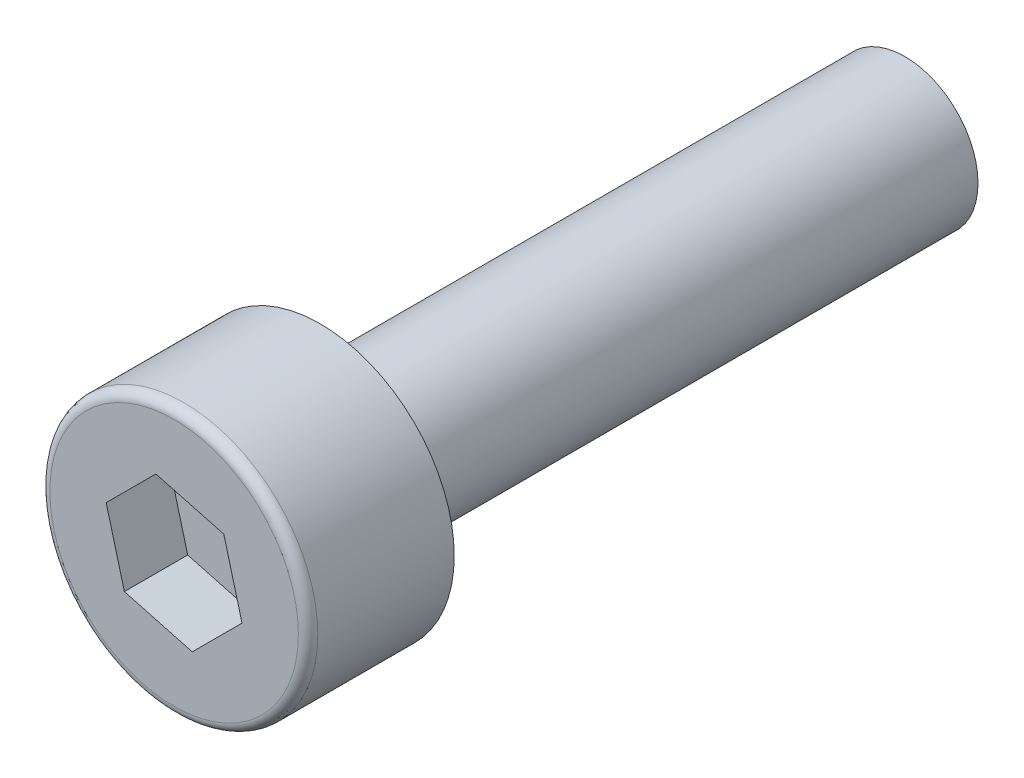
ISO-10303-21;
HEADER;
FILE_DESCRIPTION(('STEP AP214'),'2;1');
FILE_NAME('part.step','',(''),(''),'','','');
FILE_SCHEMA(('AUTOMOTIVE_DESIGN { 1 0 10303 214 1 1 1 1 }'));
ENDSEC;
DATA;
#1=APPLICATION_CONTEXT('core data for automotive mechanical design processes');
#2=APPLICATION_PROTOCOL_DEFINITION('international standard','automotive_design',2000,#1);
#3=PRODUCT_CONTEXT('',#1,'mechanical');
#4=PRODUCT('Part','Part','',(#3));
#5=PRODUCT_RELATED_PRODUCT_CATEGORY('part','',(#4));
#6=PRODUCT_DEFINITION_FORMATION('','',#4);
#7=PRODUCT_DEFINITION_CONTEXT('part definition',#1,'design');
#8=PRODUCT_DEFINITION('design','',#6,#7);
#9=PRODUCT_DEFINITION_SHAPE('','',#8);
#10=(LENGTH_UNIT() NAMED_UNIT(*) SI_UNIT(.MILLI.,.METRE.));
#11=(NAMED_UNIT(*) PLANE_ANGLE_UNIT() SI_UNIT($,.RADIAN.));
#12=(NAMED_UNIT(*) SI_UNIT($,.STERADIAN.) SOLID_ANGLE_UNIT());
#13=UNCERTAINTY_MEASURE_WITH_UNIT(LENGTH_MEASURE(1.E-05),#10,'distance_accuracy_value','');
#14=(GEOMETRIC_REPRESENTATION_CONTEXT(3) GLOBAL_UNCERTAINTY_ASSIGNED_CONTEXT((#13)) GLOBAL_UNIT_ASSIGNED_CONTEXT((#10,
#11,#12)) REPRESENTATION_CONTEXT('',''));
#15=CARTESIAN_POINT('',(0.,0.,0.));
#16=DIRECTION('',(0.,0.,1.));
#17=DIRECTION('',(1.,0.,0.));
#18=AXIS2_PLACEMENT_3D('',#15,#16,#17);
#19=CARTESIAN_POINT('',(0.,0.,0.));
#20=DIRECTION('',(0.,0.,1.));
#21=DIRECTION('',(1.,0.,0.));
#22=AXIS2_PLACEMENT_3D('',#19,#20,#21);
#23=PLANE('',#22);
#24=CARTESIAN_POINT('',(0.,0.,0.));
#25=DIRECTION('',(0.,0.,1.));
#26=DIRECTION('',(1.,0.,0.));
#27=AXIS2_PLACEMENT_3D('',#24,#25,#26);
#28=CIRCLE('',#27,2.75);
#29=CARTESIAN_POINT('',(2.75,0.,0.));
#30=VERTEX_POINT('',#29);
#31=EDGE_CURVE('E137',#30,#30,#28,.T.);
#32=ORIENTED_EDGE('',*,*,#31,.F.);
#33=EDGE_LOOP('',(#32));
#34=FACE_BOUND('',#33,.T.);
#35=CARTESIAN_POINT('',(0.,0.,0.));
#36=DIRECTION('',(0.,0.,1.));
#37=DIRECTION('',(1.,0.,0.));
#38=AXIS2_PLACEMENT_3D('',#35,#36,#37);
#39=CIRCLE('',#38,1.5);
#40=CARTESIAN_POINT('',(1.5,0.,0.));
#41=VERTEX_POINT('',#40);
#42=EDGE_CURVE('E145',#41,#41,#39,.F.);
#43=ORIENTED_EDGE('',*,*,#42,.F.);
#44=EDGE_LOOP('',(#43));
#45=FACE_BOUND('',#44,.T.);
#46=ADVANCED_FACE('F34',(#34,#45),#23,.F.);
#47=CARTESIAN_POINT('',(0.,0.,3.));
#48=DIRECTION('',(0.,0.,-1.));
#49=DIRECTION('',(-1.,0.,0.));
#50=AXIS2_PLACEMENT_3D('',#47,#48,#49);
#51=CYLINDRICAL_SURFACE('',#50,2.75);
#52=CARTESIAN_POINT('',(0.,0.,2.8));
#53=DIRECTION('',(0.,0.,1.));
#54=DIRECTION('',(1.,0.,0.));
#55=AXIS2_PLACEMENT_3D('',#52,#53,#54);
#56=CIRCLE('',#55,2.75);
#57=CARTESIAN_POINT('',(2.75,0.,2.8));
#58=VERTEX_POINT('',#57);
#59=EDGE_CURVE('E11',#58,#58,#56,.F.);
#60=ORIENTED_EDGE('',*,*,#59,.T.);
#61=EDGE_LOOP('',(#60));
#62=FACE_BOUND('',#61,.T.);
#63=ORIENTED_EDGE('',*,*,#31,.T.);
#64=EDGE_LOOP('',(#63));
#65=FACE_BOUND('',#64,.T.);
#66=ADVANCED_FACE('F164',(#62,#65),#51,.T.);
#67=CARTESIAN_POINT('',(0.,0.,3.));
#68=DIRECTION('',(0.,0.,1.));
#69=DIRECTION('',(1.,0.,0.));
#70=AXIS2_PLACEMENT_3D('',#67,#68,#69);
#71=PLANE('',#70);
#72=CARTESIAN_POINT('',(0.,0.,3.));
#73=DIRECTION('',(0.,0.,1.));
#74=DIRECTION('',(1.,0.,0.));
#75=AXIS2_PLACEMENT_3D('',#72,#73,#74);
#76=CIRCLE('',#75,2.55);
#77=CARTESIAN_POINT('',(2.55,0.,3.));
#78=VERTEX_POINT('',#77);
#79=EDGE_CURVE('E42',#78,#78,#76,.T.);
#80=ORIENTED_EDGE('',*,*,#79,.T.);
#81=EDGE_LOOP('',(#80));
#82=FACE_BOUND('',#81,.T.);
#83=DIRECTION('',(0.258819045102521,-0.965925826289068,0.));
#84=VECTOR('',#83,1.);
#85=CARTESIAN_POINT('',(-1.39419383956301,0.373573113403356,3.));
#86=LINE('',#85,#84);
#87=CARTESIAN_POINT('',(-1.39419383956301,0.373573113403356,3.));
#88=VERTEX_POINT('',#87);
#89=CARTESIAN_POINT('',(-1.02062072615966,-1.02062072615966,3.));
#90=VERTEX_POINT('',#89);
#91=EDGE_CURVE('E49',#88,#90,#86,.T.);
#92=ORIENTED_EDGE('',*,*,#91,.F.);
#93=DIRECTION('',(-0.707106781186548,-0.707106781186548,0.));
#94=VECTOR('',#93,1.);
#95=CARTESIAN_POINT('',(-0.373573113403355,1.39419383956301,3.));
#96=LINE('',#95,#94);
#97=CARTESIAN_POINT('',(-0.373573113403355,1.39419383956301,3.));
#98=VERTEX_POINT('',#97);
#99=EDGE_CURVE('E133',#98,#88,#96,.T.);
#100=ORIENTED_EDGE('',*,*,#99,.F.);
#101=DIRECTION('',(-0.965925826289068,0.258819045102521,0.));
#102=VECTOR('',#101,1.);
#103=CARTESIAN_POINT('',(1.02062072615966,1.02062072615966,3.));
#104=LINE('',#103,#102);
#105=CARTESIAN_POINT('',(1.02062072615966,1.02062072615966,3.));
#106=VERTEX_POINT('',#105);
#107=EDGE_CURVE('E131',#106,#98,#104,.T.);
#108=ORIENTED_EDGE('',*,*,#107,.F.);
#109=DIRECTION('',(-0.258819045102521,0.965925826289068,0.));
#110=VECTOR('',#109,1.);
#111=CARTESIAN_POINT('',(1.39419383956301,-0.373573113403355,3.));
#112=LINE('',#111,#110);
#113=CARTESIAN_POINT('',(1.39419383956301,-0.373573113403355,3.));
#114=VERTEX_POINT('',#113);
#115=EDGE_CURVE('E97',#114,#106,#112,.T.);
#116=ORIENTED_EDGE('',*,*,#115,.F.);
#117=DIRECTION('',(0.707106781186548,0.707106781186548,0.));
#118=VECTOR('',#117,1.);
#119=CARTESIAN_POINT('',(0.373573113403355,-1.39419383956301,3.));
#120=LINE('',#119,#118);
#121=CARTESIAN_POINT('',(0.373573113403355,-1.39419383956301,3.));
#122=VERTEX_POINT('',#121);
#123=EDGE_CURVE('E127',#122,#114,#120,.T.);
#124=ORIENTED_EDGE('',*,*,#123,.F.);
#125=DIRECTION('',(0.965925826289068,-0.258819045102521,0.));
#126=VECTOR('',#125,1.);
#127=CARTESIAN_POINT('',(-1.02062072615966,-1.02062072615966,3.));
#128=LINE('',#127,#126);
#129=EDGE_CURVE('E123',#90,#122,#128,.T.);
#130=ORIENTED_EDGE('',*,*,#129,.F.);
#131=EDGE_LOOP('',(#92,#100,#108,#116,#124,#130));
#132=FACE_BOUND('',#131,.T.);
#133=ADVANCED_FACE('F150',(#82,#132),#71,.T.);
#134=CARTESIAN_POINT('',(-1.39419383956301,0.373573113403356,1.7));
#135=DIRECTION('',(-0.965925826289068,-0.258819045102521,0.));
#136=DIRECTION('',(0.258819045102521,-0.965925826289068,0.));
#137=AXIS2_PLACEMENT_3D('',#134,#135,#136);
#138=PLANE('',#137);
#139=ORIENTED_EDGE('',*,*,#91,.T.);
#140=DIRECTION('',(0.,0.,1.));
#141=VECTOR('',#140,1.);
#142=CARTESIAN_POINT('',(-1.02062072615966,-1.02062072615966,1.7));
#143=LINE('',#142,#141);
#144=CARTESIAN_POINT('',(-1.02062072615966,-1.02062072615966,1.7));
#145=VERTEX_POINT('',#144);
#146=EDGE_CURVE('E79',#145,#90,#143,.T.);
#147=ORIENTED_EDGE('',*,*,#146,.F.);
#148=DIRECTION('',(0.258819045102521,-0.965925826289068,0.));
#149=VECTOR('',#148,1.);
#150=CARTESIAN_POINT('',(-1.39419383956301,0.373573113403356,1.7));
#151=LINE('',#150,#149);
#152=CARTESIAN_POINT('',(-1.39419383956301,0.373573113403356,1.7));
#153=VERTEX_POINT('',#152);
#154=EDGE_CURVE('E135',#153,#145,#151,.T.);
#155=ORIENTED_EDGE('',*,*,#154,.F.);
#156=DIRECTION('',(0.,0.,1.));
#157=VECTOR('',#156,1.);
#158=CARTESIAN_POINT('',(-1.39419383956301,0.373573113403356,1.7));
#159=LINE('',#158,#157);
#160=EDGE_CURVE('E57',#153,#88,#159,.T.);
#161=ORIENTED_EDGE('',*,*,#160,.T.);
#162=EDGE_LOOP('',(#139,#147,#155,#161));
#163=FACE_BOUND('',#162,.T.);
#164=ADVANCED_FACE('F176',(#163),#138,.F.);
#165=CARTESIAN_POINT('',(-0.373573113403355,1.39419383956301,1.7));
#166=DIRECTION('',(-0.707106781186548,0.707106781186548,0.));
#167=DIRECTION('',(-0.707106781186548,-0.707106781186548,0.));
#168=AXIS2_PLACEMENT_3D('',#165,#166,#167);
#169=PLANE('',#168);
#170=ORIENTED_EDGE('',*,*,#99,.T.);
#171=ORIENTED_EDGE('',*,*,#160,.F.);
#172=DIRECTION('',(-0.707106781186548,-0.707106781186548,0.));
#173=VECTOR('',#172,1.);
#174=CARTESIAN_POINT('',(-0.373573113403355,1.39419383956301,1.7));
#175=LINE('',#174,#173);
#176=CARTESIAN_POINT('',(-0.373573113403355,1.39419383956301,1.7));
#177=VERTEX_POINT('',#176);
#178=EDGE_CURVE('E109',#177,#153,#175,.T.);
#179=ORIENTED_EDGE('',*,*,#178,.F.);
#180=DIRECTION('',(0.,0.,1.));
#181=VECTOR('',#180,1.);
#182=CARTESIAN_POINT('',(-0.373573113403355,1.39419383956301,1.7));
#183=LINE('',#182,#181);
#184=EDGE_CURVE('E101',#177,#98,#183,.T.);
#185=ORIENTED_EDGE('',*,*,#184,.T.);
#186=EDGE_LOOP('',(#170,#171,#179,#185));
#187=FACE_BOUND('',#186,.T.);
#188=ADVANCED_FACE('F179',(#187),#169,.F.);
#189=CARTESIAN_POINT('',(1.02062072615966,1.02062072615966,1.7));
#190=DIRECTION('',(0.258819045102521,0.965925826289068,0.));
#191=DIRECTION('',(-0.965925826289068,0.258819045102521,0.));
#192=AXIS2_PLACEMENT_3D('',#189,#190,#191);
#193=PLANE('',#192);
#194=ORIENTED_EDGE('',*,*,#107,.T.);
#195=ORIENTED_EDGE('',*,*,#184,.F.);
#196=DIRECTION('',(-0.965925826289068,0.258819045102521,0.));
#197=VECTOR('',#196,1.);
#198=CARTESIAN_POINT('',(1.02062072615966,1.02062072615966,1.7));
#199=LINE('',#198,#197);
#200=CARTESIAN_POINT('',(1.02062072615966,1.02062072615966,1.7));
#201=VERTEX_POINT('',#200);
#202=EDGE_CURVE('E105',#201,#177,#199,.T.);
#203=ORIENTED_EDGE('',*,*,#202,.F.);
#204=DIRECTION('',(0.,0.,1.));
#205=VECTOR('',#204,1.);
#206=CARTESIAN_POINT('',(1.02062072615966,1.02062072615966,1.7));
#207=LINE('',#206,#205);
#208=EDGE_CURVE('E90',#201,#106,#207,.T.);
#209=ORIENTED_EDGE('',*,*,#208,.T.);
#210=EDGE_LOOP('',(#194,#195,#203,#209));
#211=FACE_BOUND('',#210,.T.);
#212=ADVANCED_FACE('F106',(#211),#193,.F.);
#213=CARTESIAN_POINT('',(1.39419383956301,-0.373573113403355,1.7));
#214=DIRECTION('',(0.965925826289068,0.258819045102521,0.));
#215=DIRECTION('',(-0.258819045102521,0.965925826289068,0.));
#216=AXIS2_PLACEMENT_3D('',#213,#214,#215);
#217=PLANE('',#216);
#218=ORIENTED_EDGE('',*,*,#115,.T.);
#219=ORIENTED_EDGE('',*,*,#208,.F.);
#220=DIRECTION('',(-0.258819045102521,0.965925826289068,0.));
#221=VECTOR('',#220,1.);
#222=CARTESIAN_POINT('',(1.39419383956301,-0.373573113403355,1.7));
#223=LINE('',#222,#221);
#224=CARTESIAN_POINT('',(1.39419383956301,-0.373573113403355,1.7));
#225=VERTEX_POINT('',#224);
#226=EDGE_CURVE('E94',#225,#201,#223,.T.);
#227=ORIENTED_EDGE('',*,*,#226,.F.);
#228=DIRECTION('',(0.,0.,1.));
#229=VECTOR('',#228,1.);
#230=CARTESIAN_POINT('',(1.39419383956301,-0.373573113403355,1.7));
#231=LINE('',#230,#229);
#232=EDGE_CURVE('E102',#225,#114,#231,.T.);
#233=ORIENTED_EDGE('',*,*,#232,.T.);
#234=EDGE_LOOP('',(#218,#219,#227,#233));
#235=FACE_BOUND('',#234,.T.);
#236=ADVANCED_FACE('F92',(#235),#217,.F.);
#237=CARTESIAN_POINT('',(0.373573113403355,-1.39419383956301,1.7));
#238=DIRECTION('',(0.707106781186548,-0.707106781186548,0.));
#239=DIRECTION('',(0.707106781186548,0.707106781186548,0.));
#240=AXIS2_PLACEMENT_3D('',#237,#238,#239);
#241=PLANE('',#240);
#242=ORIENTED_EDGE('',*,*,#123,.T.);
#243=ORIENTED_EDGE('',*,*,#232,.F.);
#244=DIRECTION('',(0.707106781186548,0.707106781186548,0.));
#245=VECTOR('',#244,1.);
#246=CARTESIAN_POINT('',(0.373573113403355,-1.39419383956301,1.7));
#247=LINE('',#246,#245);
#248=CARTESIAN_POINT('',(0.373573113403355,-1.39419383956301,1.7));
#249=VERTEX_POINT('',#248);
#250=EDGE_CURVE('E115',#249,#225,#247,.T.);
#251=ORIENTED_EDGE('',*,*,#250,.F.);
#252=DIRECTION('',(0.,0.,1.));
#253=VECTOR('',#252,1.);
#254=CARTESIAN_POINT('',(0.373573113403355,-1.39419383956301,1.7));
#255=LINE('',#254,#253);
#256=EDGE_CURVE('E140',#249,#122,#255,.T.);
#257=ORIENTED_EDGE('',*,*,#256,.T.);
#258=EDGE_LOOP('',(#242,#243,#251,#257));
#259=FACE_BOUND('',#258,.T.);
#260=ADVANCED_FACE('F183',(#259),#241,.F.);
#261=CARTESIAN_POINT('',(-1.02062072615966,-1.02062072615966,1.7));
#262=DIRECTION('',(-0.258819045102521,-0.965925826289068,0.));
#263=DIRECTION('',(0.965925826289068,-0.258819045102521,0.));
#264=AXIS2_PLACEMENT_3D('',#261,#262,#263);
#265=PLANE('',#264);
#266=ORIENTED_EDGE('',*,*,#129,.T.);
#267=ORIENTED_EDGE('',*,*,#256,.F.);
#268=DIRECTION('',(0.965925826289068,-0.258819045102521,0.));
#269=VECTOR('',#268,1.);
#270=CARTESIAN_POINT('',(-1.02062072615966,-1.02062072615966,1.7));
#271=LINE('',#270,#269);
#272=EDGE_CURVE('E117',#145,#249,#271,.T.);
#273=ORIENTED_EDGE('',*,*,#272,.F.);
#274=ORIENTED_EDGE('',*,*,#146,.T.);
#275=EDGE_LOOP('',(#266,#267,#273,#274));
#276=FACE_BOUND('',#275,.T.);
#277=ADVANCED_FACE('F180',(#276),#265,.F.);
#278=CARTESIAN_POINT('',(0.,0.,1.7));
#279=DIRECTION('',(0.,0.,1.));
#280=DIRECTION('',(1.,0.,0.));
#281=AXIS2_PLACEMENT_3D('',#278,#279,#280);
#282=PLANE('',#281);
#283=ORIENTED_EDGE('',*,*,#154,.T.);
#284=ORIENTED_EDGE('',*,*,#272,.T.);
#285=ORIENTED_EDGE('',*,*,#250,.T.);
#286=ORIENTED_EDGE('',*,*,#226,.T.);
#287=ORIENTED_EDGE('',*,*,#202,.T.);
#288=ORIENTED_EDGE('',*,*,#178,.T.);
#289=EDGE_LOOP('',(#283,#284,#285,#286,#287,#288));
#290=FACE_BOUND('',#289,.T.);
#291=ADVANCED_FACE('F112',(#290),#282,.T.);
#292=CARTESIAN_POINT('',(0.,0.,-12.));
#293=DIRECTION('',(0.,0.,1.));
#294=DIRECTION('',(1.,0.,0.));
#295=AXIS2_PLACEMENT_3D('',#292,#293,#294);
#296=CYLINDRICAL_SURFACE('',#295,1.5);
#297=CARTESIAN_POINT('',(0.,0.,-12.));
#298=DIRECTION('',(0.,0.,-1.));
#299=DIRECTION('',(-1.,0.,0.));
#300=AXIS2_PLACEMENT_3D('',#297,#298,#299);
#301=CIRCLE('',#300,1.5);
#302=CARTESIAN_POINT('',(-1.5,0.,-12.));
#303=VERTEX_POINT('',#302);
#304=EDGE_CURVE('E124',#303,#303,#301,.T.);
#305=ORIENTED_EDGE('',*,*,#304,.F.);
#306=EDGE_LOOP('',(#305));
#307=FACE_BOUND('',#306,.T.);
#308=ORIENTED_EDGE('',*,*,#42,.T.);
#309=EDGE_LOOP('',(#308));
#310=FACE_BOUND('',#309,.T.);
#311=ADVANCED_FACE('F159',(#307,#310),#296,.T.);
#312=CARTESIAN_POINT('',(0.,0.,-12.));
#313=DIRECTION('',(0.,0.,-1.));
#314=DIRECTION('',(-1.,0.,0.));
#315=AXIS2_PLACEMENT_3D('',#312,#313,#314);
#316=PLANE('',#315);
#317=ORIENTED_EDGE('',*,*,#304,.T.);
#318=EDGE_LOOP('',(#317));
#319=FACE_BOUND('',#318,.T.);
#320=ADVANCED_FACE('F154',(#319),#316,.T.);
#321=CARTESIAN_POINT('',(0.,0.,2.8));
#322=DIRECTION('',(0.,0.,1.));
#323=DIRECTION('',(1.,0.,0.));
#324=AXIS2_PLACEMENT_3D('',#321,#322,#323);
#325=TOROIDAL_SURFACE('',#324,2.55,0.2);
#326=ORIENTED_EDGE('',*,*,#59,.F.);
#327=EDGE_LOOP('',(#326));
#328=FACE_BOUND('',#327,.T.);
#329=ORIENTED_EDGE('',*,*,#79,.F.);
#330=EDGE_LOOP('',(#329));
#331=FACE_BOUND('',#330,.T.);
#332=ADVANCED_FACE('F36',(#328,#331),#325,.T.);
#333=CLOSED_SHELL('',(#46,#66,#133,#164,#188,#212,#236,#260,#277,#291,#311,#320,#332));
#334=MANIFOLD_SOLID_BREP('B2',#333);
#335=ADVANCED_BREP_SHAPE_REPRESENTATION('',(#18,#334),#14);
#336=SHAPE_DEFINITION_REPRESENTATION(#9,#335);
ENDSEC;
END-ISO-10303-21;
